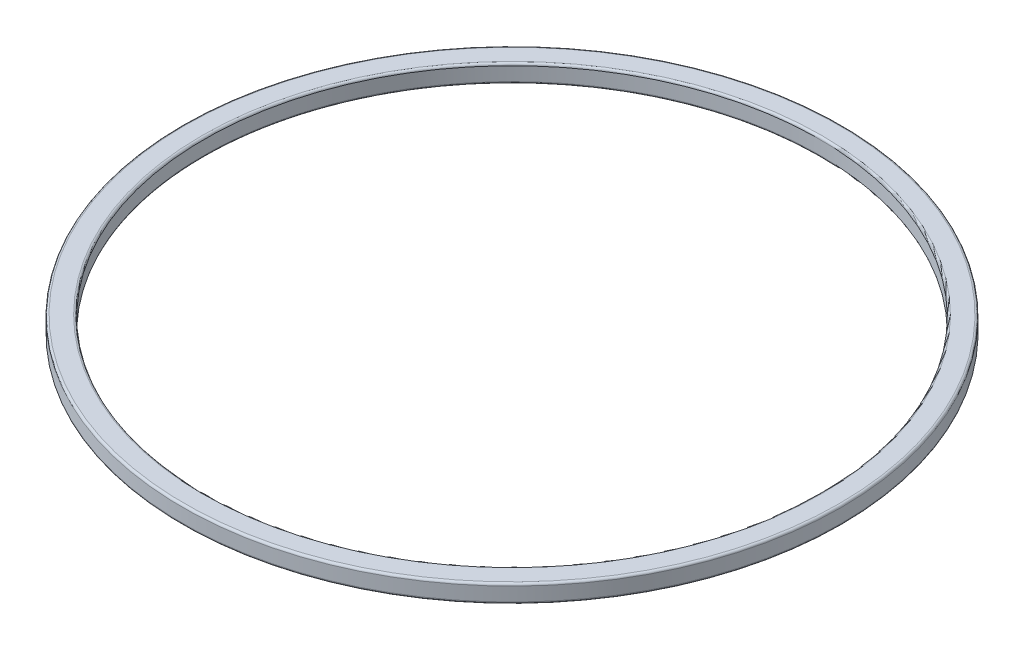
ISO-10303-21;
HEADER;
FILE_DESCRIPTION(('STEP AP214'),'2;1');
FILE_NAME('part.step','',(''),(''),'','','');
FILE_SCHEMA(('AUTOMOTIVE_DESIGN { 1 0 10303 214 1 1 1 1 }'));
ENDSEC;
DATA;
#1=APPLICATION_CONTEXT('core data for automotive mechanical design processes');
#2=APPLICATION_PROTOCOL_DEFINITION('international standard','automotive_design',2000,#1);
#3=PRODUCT_CONTEXT('',#1,'mechanical');
#4=PRODUCT('Part','Part','',(#3));
#5=PRODUCT_RELATED_PRODUCT_CATEGORY('part','',(#4));
#6=PRODUCT_DEFINITION_FORMATION('','',#4);
#7=PRODUCT_DEFINITION_CONTEXT('part definition',#1,'design');
#8=PRODUCT_DEFINITION('design','',#6,#7);
#9=PRODUCT_DEFINITION_SHAPE('','',#8);
#10=(LENGTH_UNIT() NAMED_UNIT(*) SI_UNIT(.MILLI.,.METRE.));
#11=(NAMED_UNIT(*) PLANE_ANGLE_UNIT() SI_UNIT($,.RADIAN.));
#12=(NAMED_UNIT(*) SI_UNIT($,.STERADIAN.) SOLID_ANGLE_UNIT());
#13=UNCERTAINTY_MEASURE_WITH_UNIT(LENGTH_MEASURE(1.E-05),#10,'distance_accuracy_value','');
#14=(GEOMETRIC_REPRESENTATION_CONTEXT(3) GLOBAL_UNCERTAINTY_ASSIGNED_CONTEXT((#13)) GLOBAL_UNIT_ASSIGNED_CONTEXT((#10,
#11,#12)) REPRESENTATION_CONTEXT('',''));
#15=CARTESIAN_POINT('',(0.,0.,0.));
#16=DIRECTION('',(0.,0.,1.));
#17=DIRECTION('',(1.,0.,0.));
#18=AXIS2_PLACEMENT_3D('',#15,#16,#17);
#19=CARTESIAN_POINT('',(45.5,-2.2,0.));
#20=DIRECTION('',(0.,-1.,0.));
#21=DIRECTION('',(-1.,0.,0.));
#22=AXIS2_PLACEMENT_3D('',#19,#20,#21);
#23=TOROIDAL_SURFACE('',#22,45.2,0.3);
#24=CARTESIAN_POINT('',(45.5,-2.5,0.));
#25=DIRECTION('',(0.,-1.,0.));
#26=DIRECTION('',(-1.,0.,0.));
#27=AXIS2_PLACEMENT_3D('',#24,#25,#26);
#28=CIRCLE('',#27,45.2);
#29=CARTESIAN_POINT('',(90.7,-2.5,0.));
#30=VERTEX_POINT('',#29);
#31=EDGE_CURVE('E21',#30,#30,#28,.T.);
#32=ORIENTED_EDGE('',*,*,#31,.F.);
#33=CARTESIAN_POINT('',(90.7,-2.2,0.));
#34=DIRECTION('',(0.,0.,1.));
#35=DIRECTION('',(1.,0.,0.));
#36=AXIS2_PLACEMENT_3D('',#33,#34,#35);
#37=CIRCLE('',#36,0.3);
#38=CARTESIAN_POINT('',(91.,-2.2,0.));
#39=VERTEX_POINT('',#38);
#40=EDGE_CURVE('E11',#30,#39,#37,.T.);
#41=ORIENTED_EDGE('',*,*,#40,.T.);
#42=CARTESIAN_POINT('',(45.5,-2.2,0.));
#43=DIRECTION('',(0.,1.,0.));
#44=DIRECTION('',(-1.,0.,0.));
#45=AXIS2_PLACEMENT_3D('',#42,#43,#44);
#46=CIRCLE('',#45,45.5);
#47=EDGE_CURVE('E96',#39,#39,#46,.T.);
#48=ORIENTED_EDGE('',*,*,#47,.F.);
#49=ORIENTED_EDGE('',*,*,#40,.F.);
#50=EDGE_LOOP('',(#32,#41,#48,#49));
#51=FACE_BOUND('',#50,.T.);
#52=ADVANCED_FACE('F17',(#51),#23,.T.);
#53=CARTESIAN_POINT('',(45.5,-2.5,0.));
#54=DIRECTION('',(0.,-1.,0.));
#55=DIRECTION('',(0.,0.,-1.));
#56=AXIS2_PLACEMENT_3D('',#53,#54,#55);
#57=PLANE('',#56);
#58=CARTESIAN_POINT('',(45.5,-2.5,0.));
#59=DIRECTION('',(0.,-1.,0.));
#60=DIRECTION('',(-1.,0.,0.));
#61=AXIS2_PLACEMENT_3D('',#58,#59,#60);
#62=CIRCLE('',#61,42.8);
#63=CARTESIAN_POINT('',(88.3,-2.5,0.));
#64=VERTEX_POINT('',#63);
#65=EDGE_CURVE('E101',#64,#64,#62,.T.);
#66=ORIENTED_EDGE('',*,*,#65,.F.);
#67=EDGE_LOOP('',(#66));
#68=FACE_BOUND('',#67,.T.);
#69=ORIENTED_EDGE('',*,*,#31,.T.);
#70=EDGE_LOOP('',(#69));
#71=FACE_BOUND('',#70,.T.);
#72=ADVANCED_FACE('F127',(#68,#71),#57,.T.);
#73=CARTESIAN_POINT('',(45.5,-2.2,0.));
#74=DIRECTION('',(0.,-1.,0.));
#75=DIRECTION('',(-1.,0.,0.));
#76=AXIS2_PLACEMENT_3D('',#73,#74,#75);
#77=TOROIDAL_SURFACE('',#76,42.8,0.3);
#78=CARTESIAN_POINT('',(45.5,-2.2,0.));
#79=DIRECTION('',(0.,-1.,0.));
#80=DIRECTION('',(-1.,0.,0.));
#81=AXIS2_PLACEMENT_3D('',#78,#79,#80);
#82=CIRCLE('',#81,42.5);
#83=CARTESIAN_POINT('',(88.,-2.2,0.));
#84=VERTEX_POINT('',#83);
#85=EDGE_CURVE('E100',#84,#84,#82,.T.);
#86=ORIENTED_EDGE('',*,*,#85,.F.);
#87=CARTESIAN_POINT('',(88.3,-2.2,0.));
#88=DIRECTION('',(0.,0.,1.));
#89=DIRECTION('',(1.,0.,0.));
#90=AXIS2_PLACEMENT_3D('',#87,#88,#89);
#91=CIRCLE('',#90,0.3);
#92=EDGE_CURVE('E104',#84,#64,#91,.T.);
#93=ORIENTED_EDGE('',*,*,#92,.T.);
#94=ORIENTED_EDGE('',*,*,#65,.T.);
#95=ORIENTED_EDGE('',*,*,#92,.F.);
#96=EDGE_LOOP('',(#86,#93,#94,#95));
#97=FACE_BOUND('',#96,.T.);
#98=ADVANCED_FACE('F19',(#97),#77,.T.);
#99=CARTESIAN_POINT('',(45.5,0.125,0.));
#100=DIRECTION('',(0.,-1.,0.));
#101=DIRECTION('',(-1.,0.,0.));
#102=AXIS2_PLACEMENT_3D('',#99,#100,#101);
#103=CYLINDRICAL_SURFACE('',#102,42.5);
#104=CARTESIAN_POINT('',(45.5,-0.3,0.));
#105=DIRECTION('',(0.,-1.,0.));
#106=DIRECTION('',(-1.,0.,0.));
#107=AXIS2_PLACEMENT_3D('',#104,#105,#106);
#108=CIRCLE('',#107,42.5);
#109=CARTESIAN_POINT('',(88.,-0.3,0.));
#110=VERTEX_POINT('',#109);
#111=EDGE_CURVE('E73',#110,#110,#108,.T.);
#112=ORIENTED_EDGE('',*,*,#111,.F.);
#113=DIRECTION('',(0.,-1.,0.));
#114=VECTOR('',#113,1.);
#115=CARTESIAN_POINT('',(88.,0.125,0.));
#116=LINE('',#115,#114);
#117=EDGE_CURVE('E89',#110,#84,#116,.T.);
#118=ORIENTED_EDGE('',*,*,#117,.T.);
#119=ORIENTED_EDGE('',*,*,#85,.T.);
#120=ORIENTED_EDGE('',*,*,#117,.F.);
#121=EDGE_LOOP('',(#112,#118,#119,#120));
#122=FACE_BOUND('',#121,.T.);
#123=ADVANCED_FACE('F123',(#122),#103,.F.);
#124=CARTESIAN_POINT('',(45.5,-0.3,0.));
#125=DIRECTION('',(0.,-1.,0.));
#126=DIRECTION('',(-1.,0.,0.));
#127=AXIS2_PLACEMENT_3D('',#124,#125,#126);
#128=TOROIDAL_SURFACE('',#127,42.8,0.3);
#129=CARTESIAN_POINT('',(45.5,0.,0.));
#130=DIRECTION('',(0.,-1.,0.));
#131=DIRECTION('',(-1.,0.,0.));
#132=AXIS2_PLACEMENT_3D('',#129,#130,#131);
#133=CIRCLE('',#132,42.8);
#134=CARTESIAN_POINT('',(88.3,0.,0.));
#135=VERTEX_POINT('',#134);
#136=EDGE_CURVE('E71',#135,#135,#133,.T.);
#137=ORIENTED_EDGE('',*,*,#136,.F.);
#138=CARTESIAN_POINT('',(88.3,-0.3,0.));
#139=DIRECTION('',(0.,0.,1.));
#140=DIRECTION('',(1.,0.,0.));
#141=AXIS2_PLACEMENT_3D('',#138,#139,#140);
#142=CIRCLE('',#141,0.3);
#143=EDGE_CURVE('E68',#135,#110,#142,.T.);
#144=ORIENTED_EDGE('',*,*,#143,.T.);
#145=ORIENTED_EDGE('',*,*,#111,.T.);
#146=ORIENTED_EDGE('',*,*,#143,.F.);
#147=EDGE_LOOP('',(#137,#144,#145,#146));
#148=FACE_BOUND('',#147,.T.);
#149=ADVANCED_FACE('F70',(#148),#128,.T.);
#150=CARTESIAN_POINT('',(45.5,0.,0.));
#151=DIRECTION('',(0.,-1.,0.));
#152=DIRECTION('',(0.,0.,-1.));
#153=AXIS2_PLACEMENT_3D('',#150,#151,#152);
#154=PLANE('',#153);
#155=ORIENTED_EDGE('',*,*,#136,.T.);
#156=EDGE_LOOP('',(#155));
#157=FACE_BOUND('',#156,.T.);
#158=CARTESIAN_POINT('',(45.5,0.,0.));
#159=DIRECTION('',(0.,1.,0.));
#160=DIRECTION('',(-1.,0.,0.));
#161=AXIS2_PLACEMENT_3D('',#158,#159,#160);
#162=CIRCLE('',#161,45.2);
#163=CARTESIAN_POINT('',(90.7,0.,0.));
#164=VERTEX_POINT('',#163);
#165=EDGE_CURVE('E80',#164,#164,#162,.T.);
#166=ORIENTED_EDGE('',*,*,#165,.T.);
#167=EDGE_LOOP('',(#166));
#168=FACE_BOUND('',#167,.T.);
#169=ADVANCED_FACE('F77',(#157,#168),#154,.F.);
#170=CARTESIAN_POINT('',(45.5,-0.3,0.));
#171=DIRECTION('',(0.,-1.,0.));
#172=DIRECTION('',(-1.,0.,0.));
#173=AXIS2_PLACEMENT_3D('',#170,#171,#172);
#174=TOROIDAL_SURFACE('',#173,45.2,0.3);
#175=CARTESIAN_POINT('',(45.5,-0.3,0.));
#176=DIRECTION('',(0.,-1.,0.));
#177=DIRECTION('',(-1.,0.,0.));
#178=AXIS2_PLACEMENT_3D('',#175,#176,#177);
#179=CIRCLE('',#178,45.5);
#180=CARTESIAN_POINT('',(91.,-0.3,0.));
#181=VERTEX_POINT('',#180);
#182=EDGE_CURVE('E95',#181,#181,#179,.T.);
#183=ORIENTED_EDGE('',*,*,#182,.F.);
#184=CARTESIAN_POINT('',(90.7,-0.3,0.));
#185=DIRECTION('',(0.,0.,1.));
#186=DIRECTION('',(1.,0.,0.));
#187=AXIS2_PLACEMENT_3D('',#184,#185,#186);
#188=CIRCLE('',#187,0.3);
#189=EDGE_CURVE('E85',#181,#164,#188,.T.);
#190=ORIENTED_EDGE('',*,*,#189,.T.);
#191=ORIENTED_EDGE('',*,*,#165,.F.);
#192=ORIENTED_EDGE('',*,*,#189,.F.);
#193=EDGE_LOOP('',(#183,#190,#191,#192));
#194=FACE_BOUND('',#193,.T.);
#195=ADVANCED_FACE('F181',(#194),#174,.T.);
#196=CARTESIAN_POINT('',(45.5,0.125,0.));
#197=DIRECTION('',(0.,-1.,0.));
#198=DIRECTION('',(-1.,0.,0.));
#199=AXIS2_PLACEMENT_3D('',#196,#197,#198);
#200=CYLINDRICAL_SURFACE('',#199,45.5);
#201=ORIENTED_EDGE('',*,*,#47,.T.);
#202=DIRECTION('',(0.,1.,0.));
#203=VECTOR('',#202,1.);
#204=CARTESIAN_POINT('',(91.,0.125,0.));
#205=LINE('',#204,#203);
#206=EDGE_CURVE('E91',#39,#181,#205,.T.);
#207=ORIENTED_EDGE('',*,*,#206,.T.);
#208=ORIENTED_EDGE('',*,*,#182,.T.);
#209=ORIENTED_EDGE('',*,*,#206,.F.);
#210=EDGE_LOOP('',(#201,#207,#208,#209));
#211=FACE_BOUND('',#210,.T.);
#212=ADVANCED_FACE('F175',(#211),#200,.T.);
#213=CLOSED_SHELL('',(#52,#72,#98,#123,#149,#169,#195,#212));
#214=MANIFOLD_SOLID_BREP('B1',#213);
#215=ADVANCED_BREP_SHAPE_REPRESENTATION('',(#18,#214),#14);
#216=SHAPE_DEFINITION_REPRESENTATION(#9,#215);
ENDSEC;
END-ISO-10303-21;
